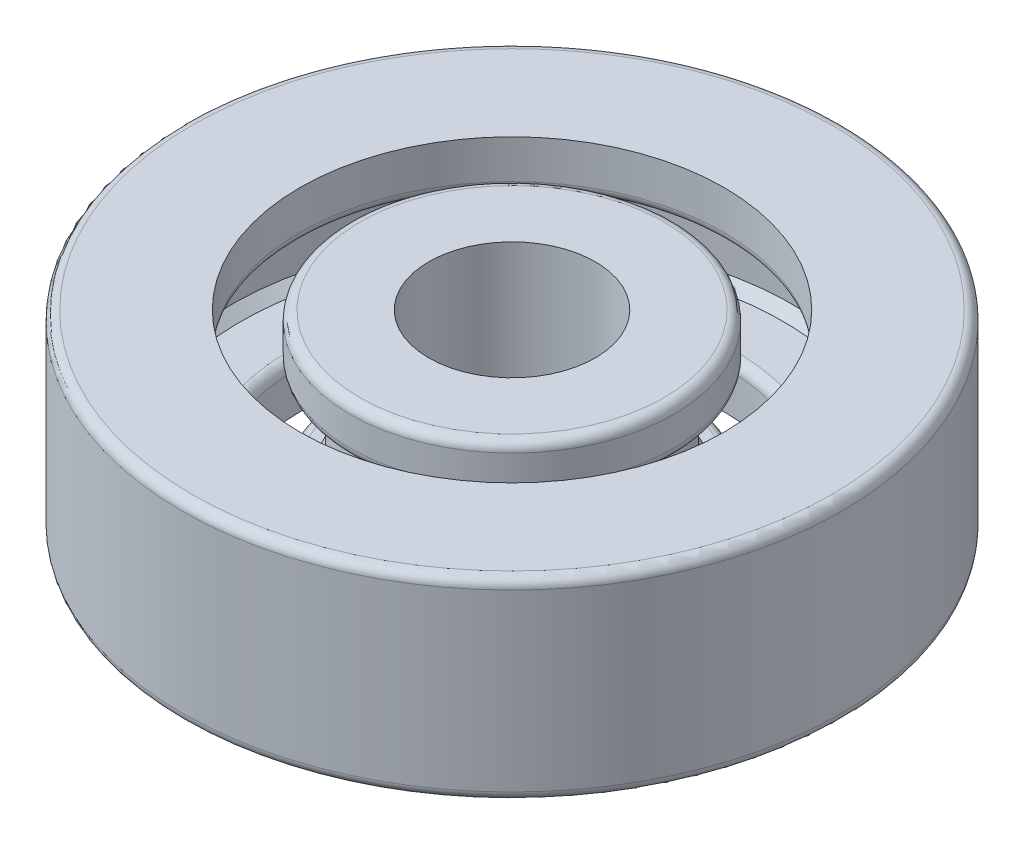
ISO-10303-21;
HEADER;
FILE_DESCRIPTION(('STEP AP214'),'2;1');
FILE_NAME('part.step','',(''),(''),'','','');
FILE_SCHEMA(('AUTOMOTIVE_DESIGN { 1 0 10303 214 1 1 1 1 }'));
ENDSEC;
DATA;
#1=APPLICATION_CONTEXT('core data for automotive mechanical design processes');
#2=APPLICATION_PROTOCOL_DEFINITION('international standard','automotive_design',2000,#1);
#3=PRODUCT_CONTEXT('',#1,'mechanical');
#4=PRODUCT('Part','Part','',(#3));
#5=PRODUCT_RELATED_PRODUCT_CATEGORY('part','',(#4));
#6=PRODUCT_DEFINITION_FORMATION('','',#4);
#7=PRODUCT_DEFINITION_CONTEXT('part definition',#1,'design');
#8=PRODUCT_DEFINITION('design','',#6,#7);
#9=PRODUCT_DEFINITION_SHAPE('','',#8);
#10=(LENGTH_UNIT() NAMED_UNIT(*) SI_UNIT(.MILLI.,.METRE.));
#11=(NAMED_UNIT(*) PLANE_ANGLE_UNIT() SI_UNIT($,.RADIAN.));
#12=(NAMED_UNIT(*) SI_UNIT($,.STERADIAN.) SOLID_ANGLE_UNIT());
#13=UNCERTAINTY_MEASURE_WITH_UNIT(LENGTH_MEASURE(1.E-05),#10,'distance_accuracy_value','');
#14=(GEOMETRIC_REPRESENTATION_CONTEXT(3) GLOBAL_UNCERTAINTY_ASSIGNED_CONTEXT((#13)) GLOBAL_UNIT_ASSIGNED_CONTEXT((#10,
#11,#12)) REPRESENTATION_CONTEXT('',''));
#15=CARTESIAN_POINT('',(0.,0.,0.));
#16=DIRECTION('',(0.,0.,1.));
#17=DIRECTION('',(1.,0.,0.));
#18=AXIS2_PLACEMENT_3D('',#15,#16,#17);
#19=CARTESIAN_POINT('',(0.,20.,0.));
#20=DIRECTION('',(0.,-1.,0.));
#21=DIRECTION('',(0.,0.,-1.));
#22=AXIS2_PLACEMENT_3D('',#19,#20,#21);
#23=CYLINDRICAL_SURFACE('',#22,33.3134067819629);
#24=CARTESIAN_POINT('',(0.,-8.,0.));
#25=DIRECTION('',(0.,1.,0.));
#26=DIRECTION('',(0.,0.,1.));
#27=AXIS2_PLACEMENT_3D('',#24,#25,#26);
#28=CIRCLE('',#27,33.3134067819629);
#29=CARTESIAN_POINT('',(0.,-8.,33.3134067819629));
#30=VERTEX_POINT('',#29);
#31=EDGE_CURVE('E82',#30,#30,#28,.T.);
#32=ORIENTED_EDGE('',*,*,#31,.T.);
#33=EDGE_LOOP('',(#32));
#34=FACE_BOUND('',#33,.T.);
#35=CARTESIAN_POINT('',(0.,-2.,0.));
#36=DIRECTION('',(0.,1.,0.));
#37=DIRECTION('',(0.,0.,1.));
#38=AXIS2_PLACEMENT_3D('',#35,#36,#37);
#39=CIRCLE('',#38,33.3134067819629);
#40=CARTESIAN_POINT('',(0.,-2.,33.3134067819629));
#41=VERTEX_POINT('',#40);
#42=EDGE_CURVE('E85',#41,#41,#39,.F.);
#43=ORIENTED_EDGE('',*,*,#42,.T.);
#44=EDGE_LOOP('',(#43));
#45=FACE_BOUND('',#44,.T.);
#46=ADVANCED_FACE('F43',(#34,#45),#23,.T.);
#47=CARTESIAN_POINT('',(0.,30.,0.));
#48=DIRECTION('',(0.,1.,0.));
#49=DIRECTION('',(0.,0.,1.));
#50=AXIS2_PLACEMENT_3D('',#47,#48,#49);
#51=PLANE('',#50);
#52=CARTESIAN_POINT('',(0.,30.,0.));
#53=DIRECTION('',(0.,1.,0.));
#54=DIRECTION('',(0.,0.,1.));
#55=AXIS2_PLACEMENT_3D('',#52,#53,#54);
#56=CIRCLE('',#55,31.3134067819629);
#57=CARTESIAN_POINT('',(0.,30.,31.3134067819629));
#58=VERTEX_POINT('',#57);
#59=EDGE_CURVE('E64',#58,#58,#56,.T.);
#60=ORIENTED_EDGE('',*,*,#59,.T.);
#61=EDGE_LOOP('',(#60));
#62=FACE_BOUND('',#61,.T.);
#63=CARTESIAN_POINT('',(0.,30.,0.));
#64=DIRECTION('',(0.,1.,0.));
#65=DIRECTION('',(0.,0.,1.));
#66=AXIS2_PLACEMENT_3D('',#63,#64,#65);
#67=CIRCLE('',#66,17.1507283853423);
#68=CARTESIAN_POINT('',(0.,30.,17.1507283853423));
#69=VERTEX_POINT('',#68);
#70=EDGE_CURVE('E88',#69,#69,#67,.T.);
#71=ORIENTED_EDGE('',*,*,#70,.F.);
#72=EDGE_LOOP('',(#71));
#73=FACE_BOUND('',#72,.T.);
#74=ADVANCED_FACE('F98',(#62,#73),#51,.T.);
#75=CARTESIAN_POINT('',(0.,-10.,0.));
#76=DIRECTION('',(0.,1.,0.));
#77=DIRECTION('',(0.,0.,1.));
#78=AXIS2_PLACEMENT_3D('',#75,#76,#77);
#79=PLANE('',#78);
#80=CARTESIAN_POINT('',(0.,-10.,0.));
#81=DIRECTION('',(0.,1.,0.));
#82=DIRECTION('',(0.,0.,1.));
#83=AXIS2_PLACEMENT_3D('',#80,#81,#82);
#84=CIRCLE('',#83,31.3134067819629);
#85=CARTESIAN_POINT('',(0.,-10.,31.3134067819629));
#86=VERTEX_POINT('',#85);
#87=EDGE_CURVE('E79',#86,#86,#84,.F.);
#88=ORIENTED_EDGE('',*,*,#87,.T.);
#89=EDGE_LOOP('',(#88));
#90=FACE_BOUND('',#89,.T.);
#91=CARTESIAN_POINT('',(0.,-10.,0.));
#92=DIRECTION('',(0.,1.,0.));
#93=DIRECTION('',(0.,0.,1.));
#94=AXIS2_PLACEMENT_3D('',#91,#92,#93);
#95=CIRCLE('',#94,17.1507283853423);
#96=CARTESIAN_POINT('',(0.,-10.,17.1507283853423));
#97=VERTEX_POINT('',#96);
#98=EDGE_CURVE('E89',#97,#97,#95,.T.);
#99=ORIENTED_EDGE('',*,*,#98,.T.);
#100=EDGE_LOOP('',(#99));
#101=FACE_BOUND('',#100,.T.);
#102=ADVANCED_FACE('F100',(#90,#101),#79,.F.);
#103=CARTESIAN_POINT('',(0.,22.,0.));
#104=DIRECTION('',(0.,1.,0.));
#105=DIRECTION('',(0.,0.,1.));
#106=AXIS2_PLACEMENT_3D('',#103,#104,#105);
#107=CIRCLE('',#106,33.3134067819629);
#108=CARTESIAN_POINT('',(0.,22.,33.3134067819629));
#109=VERTEX_POINT('',#108);
#110=EDGE_CURVE('E70',#109,#109,#107,.T.);
#111=ORIENTED_EDGE('',*,*,#110,.T.);
#112=EDGE_LOOP('',(#111));
#113=FACE_BOUND('',#112,.T.);
#114=CARTESIAN_POINT('',(0.,28.,0.));
#115=DIRECTION('',(0.,1.,0.));
#116=DIRECTION('',(0.,0.,1.));
#117=AXIS2_PLACEMENT_3D('',#114,#115,#116);
#118=CIRCLE('',#117,33.3134067819629);
#119=CARTESIAN_POINT('',(0.,28.,33.3134067819629));
#120=VERTEX_POINT('',#119);
#121=EDGE_CURVE('E73',#120,#120,#118,.F.);
#122=ORIENTED_EDGE('',*,*,#121,.T.);
#123=EDGE_LOOP('',(#122));
#124=FACE_BOUND('',#123,.T.);
#125=ADVANCED_FACE('F107',(#113,#124),#23,.T.);
#126=CARTESIAN_POINT('',(0.,20.,0.));
#127=DIRECTION('',(0.,-1.,0.));
#128=DIRECTION('',(0.,0.,-1.));
#129=AXIS2_PLACEMENT_3D('',#126,#127,#128);
#130=CYLINDRICAL_SURFACE('',#129,17.1507283853423);
#131=ORIENTED_EDGE('',*,*,#70,.T.);
#132=EDGE_LOOP('',(#131));
#133=FACE_BOUND('',#132,.T.);
#134=ORIENTED_EDGE('',*,*,#98,.F.);
#135=EDGE_LOOP('',(#134));
#136=FACE_BOUND('',#135,.T.);
#137=ADVANCED_FACE('F95',(#133,#136),#130,.F.);
#138=CARTESIAN_POINT('',(0.,20.,0.));
#139=DIRECTION('',(0.,1.,0.));
#140=DIRECTION('',(0.,0.,1.));
#141=AXIS2_PLACEMENT_3D('',#138,#139,#140);
#142=PLANE('',#141);
#143=CARTESIAN_POINT('',(0.,20.,0.));
#144=DIRECTION('',(0.,1.,0.));
#145=DIRECTION('',(0.,0.,1.));
#146=AXIS2_PLACEMENT_3D('',#143,#144,#145);
#147=CIRCLE('',#146,29.1507283853424);
#148=CARTESIAN_POINT('',(0.,20.,29.1507283853424));
#149=VERTEX_POINT('',#148);
#150=EDGE_CURVE('E59',#149,#149,#147,.T.);
#151=ORIENTED_EDGE('',*,*,#150,.T.);
#152=EDGE_LOOP('',(#151));
#153=FACE_BOUND('',#152,.T.);
#154=CARTESIAN_POINT('',(0.,20.,0.));
#155=DIRECTION('',(0.,1.,0.));
#156=DIRECTION('',(0.,0.,1.));
#157=AXIS2_PLACEMENT_3D('',#154,#155,#156);
#158=CIRCLE('',#157,31.3134067819629);
#159=CARTESIAN_POINT('',(0.,20.,31.3134067819629));
#160=VERTEX_POINT('',#159);
#161=EDGE_CURVE('E67',#160,#160,#158,.F.);
#162=ORIENTED_EDGE('',*,*,#161,.T.);
#163=EDGE_LOOP('',(#162));
#164=FACE_BOUND('',#163,.T.);
#165=ADVANCED_FACE('F116',(#153,#164),#142,.F.);
#166=CARTESIAN_POINT('',(0.,0.,0.));
#167=DIRECTION('',(0.,1.,0.));
#168=DIRECTION('',(0.,0.,1.));
#169=AXIS2_PLACEMENT_3D('',#166,#167,#168);
#170=PLANE('',#169);
#171=CARTESIAN_POINT('',(0.,0.,0.));
#172=DIRECTION('',(0.,1.,0.));
#173=DIRECTION('',(0.,0.,1.));
#174=AXIS2_PLACEMENT_3D('',#171,#172,#173);
#175=CIRCLE('',#174,29.1507283853423);
#176=CARTESIAN_POINT('',(0.,0.,29.1507283853423));
#177=VERTEX_POINT('',#176);
#178=EDGE_CURVE('E11',#177,#177,#175,.F.);
#179=ORIENTED_EDGE('',*,*,#178,.T.);
#180=EDGE_LOOP('',(#179));
#181=FACE_BOUND('',#180,.T.);
#182=CARTESIAN_POINT('',(0.,0.,0.));
#183=DIRECTION('',(0.,1.,0.));
#184=DIRECTION('',(0.,0.,1.));
#185=AXIS2_PLACEMENT_3D('',#182,#183,#184);
#186=CIRCLE('',#185,31.3134067819629);
#187=CARTESIAN_POINT('',(0.,0.,31.3134067819629));
#188=VERTEX_POINT('',#187);
#189=EDGE_CURVE('E76',#188,#188,#186,.T.);
#190=ORIENTED_EDGE('',*,*,#189,.T.);
#191=EDGE_LOOP('',(#190));
#192=FACE_BOUND('',#191,.T.);
#193=ADVANCED_FACE('F148',(#181,#192),#170,.T.);
#194=CARTESIAN_POINT('',(0.,20.,0.));
#195=DIRECTION('',(0.,-1.,0.));
#196=DIRECTION('',(0.,0.,-1.));
#197=AXIS2_PLACEMENT_3D('',#194,#195,#196);
#198=CYLINDRICAL_SURFACE('',#197,27.1507283853423);
#199=CARTESIAN_POINT('',(0.,18.,0.));
#200=DIRECTION('',(0.,1.,0.));
#201=DIRECTION('',(0.,0.,1.));
#202=AXIS2_PLACEMENT_3D('',#199,#200,#201);
#203=CIRCLE('',#202,27.1507283853423);
#204=CARTESIAN_POINT('',(0.,18.,27.1507283853423));
#205=VERTEX_POINT('',#204);
#206=EDGE_CURVE('E51',#205,#205,#203,.F.);
#207=ORIENTED_EDGE('',*,*,#206,.T.);
#208=EDGE_LOOP('',(#207));
#209=FACE_BOUND('',#208,.T.);
#210=CARTESIAN_POINT('',(0.,2.00000000000003,0.));
#211=DIRECTION('',(0.,1.,0.));
#212=DIRECTION('',(0.,0.,1.));
#213=AXIS2_PLACEMENT_3D('',#210,#211,#212);
#214=CIRCLE('',#213,27.1507283853423);
#215=CARTESIAN_POINT('',(0.,2.00000000000003,27.1507283853423));
#216=VERTEX_POINT('',#215);
#217=EDGE_CURVE('E55',#216,#216,#214,.T.);
#218=ORIENTED_EDGE('',*,*,#217,.T.);
#219=EDGE_LOOP('',(#218));
#220=FACE_BOUND('',#219,.T.);
#221=ADVANCED_FACE('F121',(#209,#220),#198,.T.);
#222=CARTESIAN_POINT('',(0.,-8.,0.));
#223=DIRECTION('',(0.,1.,0.));
#224=DIRECTION('',(0.,0.,1.));
#225=AXIS2_PLACEMENT_3D('',#222,#223,#224);
#226=TOROIDAL_SURFACE('',#225,31.3134067819629,2.);
#227=ORIENTED_EDGE('',*,*,#87,.F.);
#228=EDGE_LOOP('',(#227));
#229=FACE_BOUND('',#228,.T.);
#230=ORIENTED_EDGE('',*,*,#31,.F.);
#231=EDGE_LOOP('',(#230));
#232=FACE_BOUND('',#231,.T.);
#233=ADVANCED_FACE('F117',(#229,#232),#226,.T.);
#234=CARTESIAN_POINT('',(0.,-2.,0.));
#235=DIRECTION('',(0.,1.,0.));
#236=DIRECTION('',(0.,0.,1.));
#237=AXIS2_PLACEMENT_3D('',#234,#235,#236);
#238=TOROIDAL_SURFACE('',#237,31.3134067819629,2.);
#239=ORIENTED_EDGE('',*,*,#42,.F.);
#240=EDGE_LOOP('',(#239));
#241=FACE_BOUND('',#240,.T.);
#242=ORIENTED_EDGE('',*,*,#189,.F.);
#243=EDGE_LOOP('',(#242));
#244=FACE_BOUND('',#243,.T.);
#245=ADVANCED_FACE('F120',(#241,#244),#238,.T.);
#246=CARTESIAN_POINT('',(0.,22.,0.));
#247=DIRECTION('',(0.,1.,0.));
#248=DIRECTION('',(0.,0.,1.));
#249=AXIS2_PLACEMENT_3D('',#246,#247,#248);
#250=TOROIDAL_SURFACE('',#249,31.3134067819629,2.);
#251=ORIENTED_EDGE('',*,*,#161,.F.);
#252=EDGE_LOOP('',(#251));
#253=FACE_BOUND('',#252,.T.);
#254=ORIENTED_EDGE('',*,*,#110,.F.);
#255=EDGE_LOOP('',(#254));
#256=FACE_BOUND('',#255,.T.);
#257=ADVANCED_FACE('F125',(#253,#256),#250,.T.);
#258=CARTESIAN_POINT('',(0.,28.,0.));
#259=DIRECTION('',(0.,1.,0.));
#260=DIRECTION('',(0.,0.,1.));
#261=AXIS2_PLACEMENT_3D('',#258,#259,#260);
#262=TOROIDAL_SURFACE('',#261,31.3134067819629,2.);
#263=ORIENTED_EDGE('',*,*,#121,.F.);
#264=EDGE_LOOP('',(#263));
#265=FACE_BOUND('',#264,.T.);
#266=ORIENTED_EDGE('',*,*,#59,.F.);
#267=EDGE_LOOP('',(#266));
#268=FACE_BOUND('',#267,.T.);
#269=ADVANCED_FACE('F129',(#265,#268),#262,.T.);
#270=CARTESIAN_POINT('',(0.,20.,0.));
#271=DIRECTION('',(0.,1.,0.));
#272=DIRECTION('',(0.,0.,1.));
#273=AXIS2_PLACEMENT_3D('',#270,#271,#272);
#274=CONICAL_SURFACE('',#273,29.1507283853424,0.785398163397453);
#275=ORIENTED_EDGE('',*,*,#206,.F.);
#276=EDGE_LOOP('',(#275));
#277=FACE_BOUND('',#276,.T.);
#278=ORIENTED_EDGE('',*,*,#150,.F.);
#279=EDGE_LOOP('',(#278));
#280=FACE_BOUND('',#279,.T.);
#281=ADVANCED_FACE('F132',(#277,#280),#274,.T.);
#282=CARTESIAN_POINT('',(0.,2.00000000000003,0.));
#283=DIRECTION('',(0.,-1.,0.));
#284=DIRECTION('',(0.,0.,-1.));
#285=AXIS2_PLACEMENT_3D('',#282,#283,#284);
#286=CONICAL_SURFACE('',#285,27.1507283853423,0.785398163397441);
#287=ORIENTED_EDGE('',*,*,#178,.F.);
#288=EDGE_LOOP('',(#287));
#289=FACE_BOUND('',#288,.T.);
#290=ORIENTED_EDGE('',*,*,#217,.F.);
#291=EDGE_LOOP('',(#290));
#292=FACE_BOUND('',#291,.T.);
#293=ADVANCED_FACE('F46',(#289,#292),#286,.T.);
#294=CLOSED_SHELL('',(#46,#74,#102,#125,#137,#165,#193,#221,#233,#245,#257,#269,#281,#293));
#295=MANIFOLD_SOLID_BREP('B2',#294);
#296=CARTESIAN_POINT('',(0.,20.,0.));
#297=DIRECTION('',(0.,-1.,0.));
#298=DIRECTION('',(0.,0.,-1.));
#299=AXIS2_PLACEMENT_3D('',#296,#297,#298);
#300=CYLINDRICAL_SURFACE('',#299,43.6415264704003);
#301=CARTESIAN_POINT('',(0.,-2.,0.));
#302=DIRECTION('',(0.,1.,0.));
#303=DIRECTION('',(0.,0.,1.));
#304=AXIS2_PLACEMENT_3D('',#301,#302,#303);
#305=CIRCLE('',#304,43.6415264704003);
#306=CARTESIAN_POINT('',(0.,-2.,43.6415264704003));
#307=VERTEX_POINT('',#306);
#308=EDGE_CURVE('E302',#307,#307,#305,.T.);
#309=ORIENTED_EDGE('',*,*,#308,.T.);
#310=EDGE_LOOP('',(#309));
#311=FACE_BOUND('',#310,.T.);
#312=CARTESIAN_POINT('',(0.,-10.,0.));
#313=DIRECTION('',(0.,1.,0.));
#314=DIRECTION('',(0.,0.,1.));
#315=AXIS2_PLACEMENT_3D('',#312,#313,#314);
#316=CIRCLE('',#315,43.6415264704003);
#317=CARTESIAN_POINT('',(0.,-10.,43.6415264704003));
#318=VERTEX_POINT('',#317);
#319=EDGE_CURVE('E306',#318,#318,#316,.T.);
#320=ORIENTED_EDGE('',*,*,#319,.F.);
#321=EDGE_LOOP('',(#320));
#322=FACE_BOUND('',#321,.T.);
#323=ADVANCED_FACE('F260',(#311,#322),#300,.F.);
#324=CARTESIAN_POINT('',(0.,30.,0.));
#325=DIRECTION('',(0.,1.,0.));
#326=DIRECTION('',(0.,0.,1.));
#327=AXIS2_PLACEMENT_3D('',#324,#325,#326);
#328=PLANE('',#327);
#329=CARTESIAN_POINT('',(0.,30.,0.));
#330=DIRECTION('',(0.,1.,0.));
#331=DIRECTION('',(0.,0.,1.));
#332=AXIS2_PLACEMENT_3D('',#329,#330,#331);
#333=CIRCLE('',#332,65.8514229478172);
#334=CARTESIAN_POINT('',(0.,30.,65.8514229478172));
#335=VERTEX_POINT('',#334);
#336=EDGE_CURVE('E290',#335,#335,#333,.T.);
#337=ORIENTED_EDGE('',*,*,#336,.T.);
#338=EDGE_LOOP('',(#337));
#339=FACE_BOUND('',#338,.T.);
#340=CARTESIAN_POINT('',(0.,30.,0.));
#341=DIRECTION('',(0.,1.,0.));
#342=DIRECTION('',(0.,0.,1.));
#343=AXIS2_PLACEMENT_3D('',#340,#341,#342);
#344=CIRCLE('',#343,43.6415264704003);
#345=CARTESIAN_POINT('',(0.,30.,43.6415264704003));
#346=VERTEX_POINT('',#345);
#347=EDGE_CURVE('E305',#346,#346,#344,.T.);
#348=ORIENTED_EDGE('',*,*,#347,.F.);
#349=EDGE_LOOP('',(#348));
#350=FACE_BOUND('',#349,.T.);
#351=ADVANCED_FACE('F314',(#339,#350),#328,.T.);
#352=CARTESIAN_POINT('',(0.,-10.,0.));
#353=DIRECTION('',(0.,1.,0.));
#354=DIRECTION('',(0.,0.,1.));
#355=AXIS2_PLACEMENT_3D('',#352,#353,#354);
#356=PLANE('',#355);
#357=CARTESIAN_POINT('',(0.,-10.,0.));
#358=DIRECTION('',(0.,1.,0.));
#359=DIRECTION('',(0.,0.,1.));
#360=AXIS2_PLACEMENT_3D('',#357,#358,#359);
#361=CIRCLE('',#360,65.8514229478172);
#362=CARTESIAN_POINT('',(0.,-10.,65.8514229478172));
#363=VERTEX_POINT('',#362);
#364=EDGE_CURVE('E281',#363,#363,#361,.F.);
#365=ORIENTED_EDGE('',*,*,#364,.T.);
#366=EDGE_LOOP('',(#365));
#367=FACE_BOUND('',#366,.T.);
#368=ORIENTED_EDGE('',*,*,#319,.T.);
#369=EDGE_LOOP('',(#368));
#370=FACE_BOUND('',#369,.T.);
#371=ADVANCED_FACE('F316',(#367,#370),#356,.F.);
#372=CARTESIAN_POINT('',(0.,20.,0.));
#373=DIRECTION('',(0.,-1.,0.));
#374=DIRECTION('',(0.,0.,-1.));
#375=AXIS2_PLACEMENT_3D('',#372,#373,#374);
#376=CYLINDRICAL_SURFACE('',#375,67.8514229478172);
#377=CARTESIAN_POINT('',(0.,-8.,0.));
#378=DIRECTION('',(0.,1.,0.));
#379=DIRECTION('',(0.,0.,1.));
#380=AXIS2_PLACEMENT_3D('',#377,#378,#379);
#381=CIRCLE('',#380,67.8514229478172);
#382=CARTESIAN_POINT('',(0.,-8.,67.8514229478172));
#383=VERTEX_POINT('',#382);
#384=EDGE_CURVE('E284',#383,#383,#381,.T.);
#385=ORIENTED_EDGE('',*,*,#384,.T.);
#386=EDGE_LOOP('',(#385));
#387=FACE_BOUND('',#386,.T.);
#388=CARTESIAN_POINT('',(0.,28.,0.));
#389=DIRECTION('',(0.,1.,0.));
#390=DIRECTION('',(0.,0.,1.));
#391=AXIS2_PLACEMENT_3D('',#388,#389,#390);
#392=CIRCLE('',#391,67.8514229478172);
#393=CARTESIAN_POINT('',(0.,28.,67.8514229478172));
#394=VERTEX_POINT('',#393);
#395=EDGE_CURVE('E287',#394,#394,#392,.F.);
#396=ORIENTED_EDGE('',*,*,#395,.T.);
#397=EDGE_LOOP('',(#396));
#398=FACE_BOUND('',#397,.T.);
#399=ADVANCED_FACE('F323',(#387,#398),#376,.T.);
#400=CARTESIAN_POINT('',(0.,22.,0.));
#401=DIRECTION('',(0.,1.,0.));
#402=DIRECTION('',(0.,0.,1.));
#403=AXIS2_PLACEMENT_3D('',#400,#401,#402);
#404=CIRCLE('',#403,43.6415264704003);
#405=CARTESIAN_POINT('',(0.,22.,43.6415264704003));
#406=VERTEX_POINT('',#405);
#407=EDGE_CURVE('E293',#406,#406,#404,.F.);
#408=ORIENTED_EDGE('',*,*,#407,.T.);
#409=EDGE_LOOP('',(#408));
#410=FACE_BOUND('',#409,.T.);
#411=ORIENTED_EDGE('',*,*,#347,.T.);
#412=EDGE_LOOP('',(#411));
#413=FACE_BOUND('',#412,.T.);
#414=ADVANCED_FACE('F312',(#410,#413),#300,.F.);
#415=CARTESIAN_POINT('',(0.,20.,0.));
#416=DIRECTION('',(0.,1.,0.));
#417=DIRECTION('',(0.,0.,1.));
#418=AXIS2_PLACEMENT_3D('',#415,#416,#417);
#419=PLANE('',#418);
#420=CARTESIAN_POINT('',(0.,20.,0.));
#421=DIRECTION('',(0.,1.,0.));
#422=DIRECTION('',(0.,0.,1.));
#423=AXIS2_PLACEMENT_3D('',#420,#421,#422);
#424=CIRCLE('',#423,55.8514229478172);
#425=CARTESIAN_POINT('',(0.,20.,55.8514229478172));
#426=VERTEX_POINT('',#425);
#427=EDGE_CURVE('E268',#426,#426,#424,.F.);
#428=ORIENTED_EDGE('',*,*,#427,.T.);
#429=EDGE_LOOP('',(#428));
#430=FACE_BOUND('',#429,.T.);
#431=CARTESIAN_POINT('',(0.,20.,0.));
#432=DIRECTION('',(0.,1.,0.));
#433=DIRECTION('',(0.,0.,1.));
#434=AXIS2_PLACEMENT_3D('',#431,#432,#433);
#435=CIRCLE('',#434,45.6415264704003);
#436=CARTESIAN_POINT('',(0.,20.,45.6415264704003));
#437=VERTEX_POINT('',#436);
#438=EDGE_CURVE('E296',#437,#437,#435,.T.);
#439=ORIENTED_EDGE('',*,*,#438,.T.);
#440=EDGE_LOOP('',(#439));
#441=FACE_BOUND('',#440,.T.);
#442=ADVANCED_FACE('F370',(#430,#441),#419,.F.);
#443=CARTESIAN_POINT('',(0.,0.,0.));
#444=DIRECTION('',(0.,1.,0.));
#445=DIRECTION('',(0.,0.,1.));
#446=AXIS2_PLACEMENT_3D('',#443,#444,#445);
#447=PLANE('',#446);
#448=CARTESIAN_POINT('',(0.,0.,0.));
#449=DIRECTION('',(0.,1.,0.));
#450=DIRECTION('',(0.,0.,1.));
#451=AXIS2_PLACEMENT_3D('',#448,#449,#450);
#452=CIRCLE('',#451,55.8514229478172);
#453=CARTESIAN_POINT('',(0.,0.,55.8514229478172));
#454=VERTEX_POINT('',#453);
#455=EDGE_CURVE('E42',#454,#454,#452,.T.);
#456=ORIENTED_EDGE('',*,*,#455,.T.);
#457=EDGE_LOOP('',(#456));
#458=FACE_BOUND('',#457,.T.);
#459=CARTESIAN_POINT('',(0.,0.,0.));
#460=DIRECTION('',(0.,1.,0.));
#461=DIRECTION('',(0.,0.,1.));
#462=AXIS2_PLACEMENT_3D('',#459,#460,#461);
#463=CIRCLE('',#462,45.6415264704003);
#464=CARTESIAN_POINT('',(0.,0.,45.6415264704003));
#465=VERTEX_POINT('',#464);
#466=EDGE_CURVE('E299',#465,#465,#463,.F.);
#467=ORIENTED_EDGE('',*,*,#466,.T.);
#468=EDGE_LOOP('',(#467));
#469=FACE_BOUND('',#468,.T.);
#470=ADVANCED_FACE('F364',(#458,#469),#447,.T.);
#471=CARTESIAN_POINT('',(0.,20.,0.));
#472=DIRECTION('',(0.,-1.,0.));
#473=DIRECTION('',(0.,0.,-1.));
#474=AXIS2_PLACEMENT_3D('',#471,#472,#473);
#475=CYLINDRICAL_SURFACE('',#474,57.8514229478172);
#476=CARTESIAN_POINT('',(0.,18.,0.));
#477=DIRECTION('',(0.,1.,0.));
#478=DIRECTION('',(0.,0.,1.));
#479=AXIS2_PLACEMENT_3D('',#476,#477,#478);
#480=CIRCLE('',#479,57.8514229478172);
#481=CARTESIAN_POINT('',(0.,18.,57.8514229478172));
#482=VERTEX_POINT('',#481);
#483=EDGE_CURVE('E272',#482,#482,#480,.T.);
#484=ORIENTED_EDGE('',*,*,#483,.T.);
#485=EDGE_LOOP('',(#484));
#486=FACE_BOUND('',#485,.T.);
#487=CARTESIAN_POINT('',(0.,1.99999999999997,0.));
#488=DIRECTION('',(0.,1.,0.));
#489=DIRECTION('',(0.,0.,1.));
#490=AXIS2_PLACEMENT_3D('',#487,#488,#489);
#491=CIRCLE('',#490,57.8514229478172);
#492=CARTESIAN_POINT('',(0.,1.99999999999997,57.8514229478172));
#493=VERTEX_POINT('',#492);
#494=EDGE_CURVE('E276',#493,#493,#491,.F.);
#495=ORIENTED_EDGE('',*,*,#494,.T.);
#496=EDGE_LOOP('',(#495));
#497=FACE_BOUND('',#496,.T.);
#498=ADVANCED_FACE('F337',(#486,#497),#475,.F.);
#499=CARTESIAN_POINT('',(0.,-2.,0.));
#500=DIRECTION('',(0.,1.,0.));
#501=DIRECTION('',(0.,0.,1.));
#502=AXIS2_PLACEMENT_3D('',#499,#500,#501);
#503=TOROIDAL_SURFACE('',#502,45.6415264704003,2.);
#504=ORIENTED_EDGE('',*,*,#466,.F.);
#505=EDGE_LOOP('',(#504));
#506=FACE_BOUND('',#505,.T.);
#507=ORIENTED_EDGE('',*,*,#308,.F.);
#508=EDGE_LOOP('',(#507));
#509=FACE_BOUND('',#508,.T.);
#510=ADVANCED_FACE('F333',(#506,#509),#503,.T.);
#511=CARTESIAN_POINT('',(0.,22.,0.));
#512=DIRECTION('',(0.,1.,0.));
#513=DIRECTION('',(0.,0.,1.));
#514=AXIS2_PLACEMENT_3D('',#511,#512,#513);
#515=TOROIDAL_SURFACE('',#514,45.6415264704003,2.);
#516=ORIENTED_EDGE('',*,*,#407,.F.);
#517=EDGE_LOOP('',(#516));
#518=FACE_BOUND('',#517,.T.);
#519=ORIENTED_EDGE('',*,*,#438,.F.);
#520=EDGE_LOOP('',(#519));
#521=FACE_BOUND('',#520,.T.);
#522=ADVANCED_FACE('F336',(#518,#521),#515,.T.);
#523=CARTESIAN_POINT('',(0.,28.,0.));
#524=DIRECTION('',(0.,1.,0.));
#525=DIRECTION('',(0.,0.,1.));
#526=AXIS2_PLACEMENT_3D('',#523,#524,#525);
#527=TOROIDAL_SURFACE('',#526,65.8514229478172,2.);
#528=ORIENTED_EDGE('',*,*,#395,.F.);
#529=EDGE_LOOP('',(#528));
#530=FACE_BOUND('',#529,.T.);
#531=ORIENTED_EDGE('',*,*,#336,.F.);
#532=EDGE_LOOP('',(#531));
#533=FACE_BOUND('',#532,.T.);
#534=ADVANCED_FACE('F341',(#530,#533),#527,.T.);
#535=CARTESIAN_POINT('',(0.,-8.,0.));
#536=DIRECTION('',(0.,1.,0.));
#537=DIRECTION('',(0.,0.,1.));
#538=AXIS2_PLACEMENT_3D('',#535,#536,#537);
#539=TOROIDAL_SURFACE('',#538,65.8514229478172,2.);
#540=ORIENTED_EDGE('',*,*,#364,.F.);
#541=EDGE_LOOP('',(#540));
#542=FACE_BOUND('',#541,.T.);
#543=ORIENTED_EDGE('',*,*,#384,.F.);
#544=EDGE_LOOP('',(#543));
#545=FACE_BOUND('',#544,.T.);
#546=ADVANCED_FACE('F345',(#542,#545),#539,.T.);
#547=CARTESIAN_POINT('',(0.,18.,0.));
#548=DIRECTION('',(0.,-1.,0.));
#549=DIRECTION('',(0.,0.,-1.));
#550=AXIS2_PLACEMENT_3D('',#547,#548,#549);
#551=CONICAL_SURFACE('',#550,57.8514229478172,0.785398163397443);
#552=ORIENTED_EDGE('',*,*,#427,.F.);
#553=EDGE_LOOP('',(#552));
#554=FACE_BOUND('',#553,.T.);
#555=ORIENTED_EDGE('',*,*,#483,.F.);
#556=EDGE_LOOP('',(#555));
#557=FACE_BOUND('',#556,.T.);
#558=ADVANCED_FACE('F348',(#554,#557),#551,.F.);
#559=CARTESIAN_POINT('',(0.,0.,0.));
#560=DIRECTION('',(0.,1.,0.));
#561=DIRECTION('',(0.,0.,1.));
#562=AXIS2_PLACEMENT_3D('',#559,#560,#561);
#563=CONICAL_SURFACE('',#562,55.8514229478172,0.78539816339746);
#564=ORIENTED_EDGE('',*,*,#494,.F.);
#565=EDGE_LOOP('',(#564));
#566=FACE_BOUND('',#565,.T.);
#567=ORIENTED_EDGE('',*,*,#455,.F.);
#568=EDGE_LOOP('',(#567));
#569=FACE_BOUND('',#568,.T.);
#570=ADVANCED_FACE('F263',(#566,#569),#563,.F.);
#571=CLOSED_SHELL('',(#323,#351,#371,#399,#414,#442,#470,#498,#510,#522,#534,#546,#558,#570));
#572=MANIFOLD_SOLID_BREP('B6',#571);
#573=ADVANCED_BREP_SHAPE_REPRESENTATION('',(#18,#295,#572),#14);
#574=SHAPE_DEFINITION_REPRESENTATION(#9,#573);
ENDSEC;
END-ISO-10303-21;
